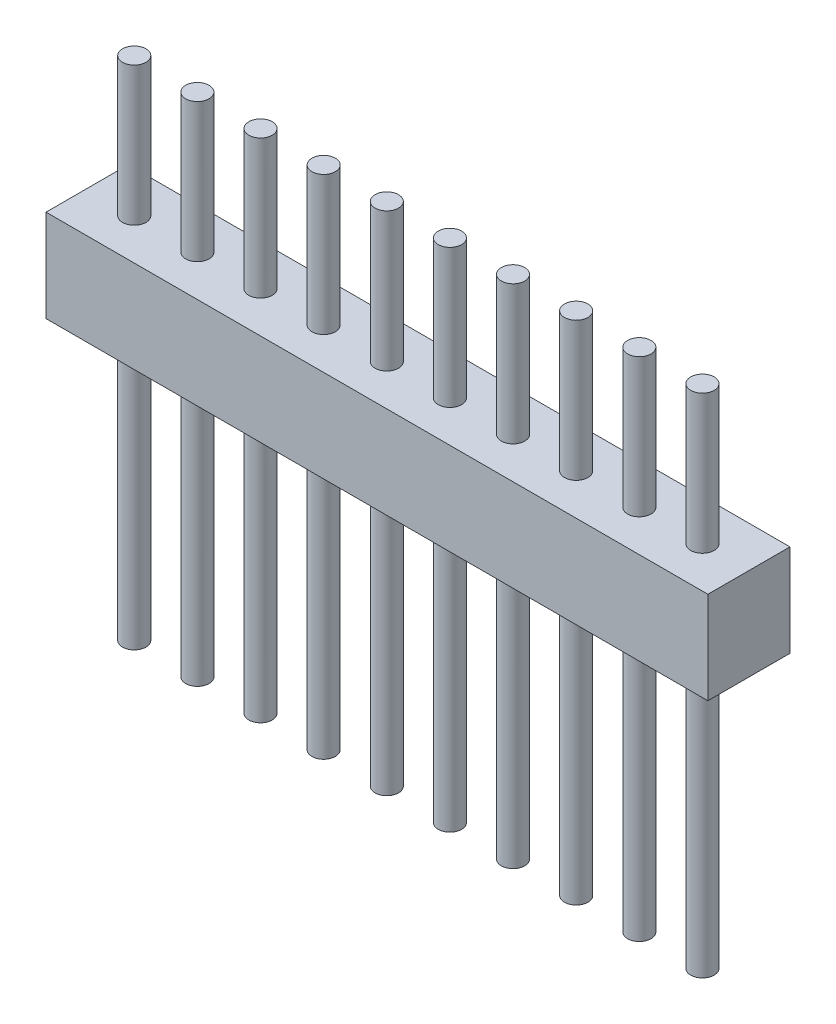
ISO-10303-21;
HEADER;
FILE_DESCRIPTION(('STEP AP214'),'2;1');
FILE_NAME('part.step','',(''),(''),'','','');
FILE_SCHEMA(('AUTOMOTIVE_DESIGN { 1 0 10303 214 1 1 1 1 }'));
ENDSEC;
DATA;
#1=APPLICATION_CONTEXT('core data for automotive mechanical design processes');
#2=APPLICATION_PROTOCOL_DEFINITION('international standard','automotive_design',2000,#1);
#3=PRODUCT_CONTEXT('',#1,'mechanical');
#4=PRODUCT('Part','Part','',(#3));
#5=PRODUCT_RELATED_PRODUCT_CATEGORY('part','',(#4));
#6=PRODUCT_DEFINITION_FORMATION('','',#4);
#7=PRODUCT_DEFINITION_CONTEXT('part definition',#1,'design');
#8=PRODUCT_DEFINITION('design','',#6,#7);
#9=PRODUCT_DEFINITION_SHAPE('','',#8);
#10=(LENGTH_UNIT() NAMED_UNIT(*) SI_UNIT(.MILLI.,.METRE.));
#11=(NAMED_UNIT(*) PLANE_ANGLE_UNIT() SI_UNIT($,.RADIAN.));
#12=(NAMED_UNIT(*) SI_UNIT($,.STERADIAN.) SOLID_ANGLE_UNIT());
#13=UNCERTAINTY_MEASURE_WITH_UNIT(LENGTH_MEASURE(1.E-05),#10,'distance_accuracy_value','');
#14=(GEOMETRIC_REPRESENTATION_CONTEXT(3) GLOBAL_UNCERTAINTY_ASSIGNED_CONTEXT((#13)) GLOBAL_UNIT_ASSIGNED_CONTEXT((#10,
#11,#12)) REPRESENTATION_CONTEXT('',''));
#15=CARTESIAN_POINT('',(0.,0.,0.));
#16=DIRECTION('',(0.,0.,1.));
#17=DIRECTION('',(1.,0.,0.));
#18=AXIS2_PLACEMENT_3D('',#15,#16,#17);
#19=CARTESIAN_POINT('',(0.,2.6,0.));
#20=DIRECTION('',(1.,0.,0.));
#21=DIRECTION('',(0.,0.,-1.));
#22=AXIS2_PLACEMENT_3D('',#19,#20,#21);
#23=PLANE('',#22);
#24=DIRECTION('',(0.,0.,1.));
#25=VECTOR('',#24,1.);
#26=CARTESIAN_POINT('',(0.,0.,0.));
#27=LINE('',#26,#25);
#28=CARTESIAN_POINT('',(0.,0.,-2.314));
#29=VERTEX_POINT('',#28);
#30=CARTESIAN_POINT('',(0.,0.,0.));
#31=VERTEX_POINT('',#30);
#32=EDGE_CURVE('E104',#29,#31,#27,.T.);
#33=ORIENTED_EDGE('',*,*,#32,.T.);
#34=DIRECTION('',(0.,-1.,0.));
#35=VECTOR('',#34,1.);
#36=CARTESIAN_POINT('',(0.,2.6,0.));
#37=LINE('',#36,#35);
#38=CARTESIAN_POINT('',(0.,2.6,0.));
#39=VERTEX_POINT('',#38);
#40=EDGE_CURVE('E95',#39,#31,#37,.T.);
#41=ORIENTED_EDGE('',*,*,#40,.F.);
#42=DIRECTION('',(0.,0.,1.));
#43=VECTOR('',#42,1.);
#44=CARTESIAN_POINT('',(0.,2.6,0.));
#45=LINE('',#44,#43);
#46=CARTESIAN_POINT('',(0.,2.6,-2.314));
#47=VERTEX_POINT('',#46);
#48=EDGE_CURVE('E89',#47,#39,#45,.T.);
#49=ORIENTED_EDGE('',*,*,#48,.F.);
#50=DIRECTION('',(0.,-1.,0.));
#51=VECTOR('',#50,1.);
#52=CARTESIAN_POINT('',(0.,2.6,-2.314));
#53=LINE('',#52,#51);
#54=EDGE_CURVE('E100',#47,#29,#53,.T.);
#55=ORIENTED_EDGE('',*,*,#54,.T.);
#56=EDGE_LOOP('',(#33,#41,#49,#55));
#57=FACE_BOUND('',#56,.T.);
#58=ADVANCED_FACE('F37',(#57),#23,.F.);
#59=CARTESIAN_POINT('',(0.,2.6,0.));
#60=DIRECTION('',(0.,0.,-1.));
#61=DIRECTION('',(-1.,0.,0.));
#62=AXIS2_PLACEMENT_3D('',#59,#60,#61);
#63=PLANE('',#62);
#64=DIRECTION('',(1.,0.,0.));
#65=VECTOR('',#64,1.);
#66=CARTESIAN_POINT('',(0.,0.,0.));
#67=LINE('',#66,#65);
#68=CARTESIAN_POINT('',(18.66,0.,0.));
#69=VERTEX_POINT('',#68);
#70=EDGE_CURVE('E94',#31,#69,#67,.T.);
#71=ORIENTED_EDGE('',*,*,#70,.T.);
#72=DIRECTION('',(0.,-1.,0.));
#73=VECTOR('',#72,1.);
#74=CARTESIAN_POINT('',(18.66,2.6,0.));
#75=LINE('',#74,#73);
#76=CARTESIAN_POINT('',(18.66,2.6,0.));
#77=VERTEX_POINT('',#76);
#78=EDGE_CURVE('E92',#77,#69,#75,.T.);
#79=ORIENTED_EDGE('',*,*,#78,.F.);
#80=DIRECTION('',(1.,0.,0.));
#81=VECTOR('',#80,1.);
#82=CARTESIAN_POINT('',(0.,2.6,0.));
#83=LINE('',#82,#81);
#84=EDGE_CURVE('E84',#39,#77,#83,.T.);
#85=ORIENTED_EDGE('',*,*,#84,.F.);
#86=ORIENTED_EDGE('',*,*,#40,.T.);
#87=EDGE_LOOP('',(#71,#79,#85,#86));
#88=FACE_BOUND('',#87,.T.);
#89=ADVANCED_FACE('F93',(#88),#63,.F.);
#90=CARTESIAN_POINT('',(18.66,2.6,0.));
#91=DIRECTION('',(-1.,0.,0.));
#92=DIRECTION('',(0.,0.,1.));
#93=AXIS2_PLACEMENT_3D('',#90,#91,#92);
#94=PLANE('',#93);
#95=DIRECTION('',(0.,0.,-1.));
#96=VECTOR('',#95,1.);
#97=CARTESIAN_POINT('',(18.66,0.,0.));
#98=LINE('',#97,#96);
#99=CARTESIAN_POINT('',(18.66,0.,-2.314));
#100=VERTEX_POINT('',#99);
#101=EDGE_CURVE('E70',#69,#100,#98,.T.);
#102=ORIENTED_EDGE('',*,*,#101,.T.);
#103=DIRECTION('',(0.,-1.,0.));
#104=VECTOR('',#103,1.);
#105=CARTESIAN_POINT('',(18.66,2.6,-2.314));
#106=LINE('',#105,#104);
#107=CARTESIAN_POINT('',(18.66,2.6,-2.314));
#108=VERTEX_POINT('',#107);
#109=EDGE_CURVE('E96',#108,#100,#106,.T.);
#110=ORIENTED_EDGE('',*,*,#109,.F.);
#111=DIRECTION('',(0.,0.,-1.));
#112=VECTOR('',#111,1.);
#113=CARTESIAN_POINT('',(18.66,2.6,0.));
#114=LINE('',#113,#112);
#115=EDGE_CURVE('E87',#77,#108,#114,.T.);
#116=ORIENTED_EDGE('',*,*,#115,.F.);
#117=ORIENTED_EDGE('',*,*,#78,.T.);
#118=EDGE_LOOP('',(#102,#110,#116,#117));
#119=FACE_BOUND('',#118,.T.);
#120=ADVANCED_FACE('F98',(#119),#94,.F.);
#121=CARTESIAN_POINT('',(0.,2.6,-2.314));
#122=DIRECTION('',(0.,0.,1.));
#123=DIRECTION('',(1.,0.,0.));
#124=AXIS2_PLACEMENT_3D('',#121,#122,#123);
#125=PLANE('',#124);
#126=DIRECTION('',(-1.,0.,0.));
#127=VECTOR('',#126,1.);
#128=CARTESIAN_POINT('',(0.,0.,-2.314));
#129=LINE('',#128,#127);
#130=EDGE_CURVE('E76',#100,#29,#129,.T.);
#131=ORIENTED_EDGE('',*,*,#130,.T.);
#132=ORIENTED_EDGE('',*,*,#54,.F.);
#133=DIRECTION('',(-1.,0.,0.));
#134=VECTOR('',#133,1.);
#135=CARTESIAN_POINT('',(0.,2.6,-2.314));
#136=LINE('',#135,#134);
#137=EDGE_CURVE('E53',#108,#47,#136,.T.);
#138=ORIENTED_EDGE('',*,*,#137,.F.);
#139=ORIENTED_EDGE('',*,*,#109,.T.);
#140=EDGE_LOOP('',(#131,#132,#138,#139));
#141=FACE_BOUND('',#140,.T.);
#142=ADVANCED_FACE('F167',(#141),#125,.F.);
#143=CARTESIAN_POINT('',(0.,2.6,0.));
#144=DIRECTION('',(0.,-1.,0.));
#145=DIRECTION('',(0.,0.,-1.));
#146=AXIS2_PLACEMENT_3D('',#143,#144,#145);
#147=PLANE('',#146);
#148=CARTESIAN_POINT('',(17.35,2.6,-1.157));
#149=DIRECTION('',(0.,-1.,0.));
#150=DIRECTION('',(0.,0.,-1.));
#151=AXIS2_PLACEMENT_3D('',#148,#149,#150);
#152=CIRCLE('',#151,0.33);
#153=CARTESIAN_POINT('',(17.35,2.6,-1.487));
#154=VERTEX_POINT('',#153);
#155=EDGE_CURVE('E600',#154,#154,#152,.T.);
#156=ORIENTED_EDGE('',*,*,#155,.T.);
#157=EDGE_LOOP('',(#156));
#158=FACE_BOUND('',#157,.T.);
#159=CARTESIAN_POINT('',(15.57,2.6,-1.157));
#160=DIRECTION('',(0.,-1.,0.));
#161=DIRECTION('',(0.,0.,-1.));
#162=AXIS2_PLACEMENT_3D('',#159,#160,#161);
#163=CIRCLE('',#162,0.33);
#164=CARTESIAN_POINT('',(15.57,2.6,-1.487));
#165=VERTEX_POINT('',#164);
#166=EDGE_CURVE('E611',#165,#165,#163,.T.);
#167=ORIENTED_EDGE('',*,*,#166,.T.);
#168=EDGE_LOOP('',(#167));
#169=FACE_BOUND('',#168,.T.);
#170=CARTESIAN_POINT('',(13.79,2.6,-1.157));
#171=DIRECTION('',(0.,-1.,0.));
#172=DIRECTION('',(0.,0.,-1.));
#173=AXIS2_PLACEMENT_3D('',#170,#171,#172);
#174=CIRCLE('',#173,0.33);
#175=CARTESIAN_POINT('',(13.79,2.6,-1.487));
#176=VERTEX_POINT('',#175);
#177=EDGE_CURVE('E620',#176,#176,#174,.T.);
#178=ORIENTED_EDGE('',*,*,#177,.T.);
#179=EDGE_LOOP('',(#178));
#180=FACE_BOUND('',#179,.T.);
#181=CARTESIAN_POINT('',(12.01,2.6,-1.157));
#182=DIRECTION('',(0.,-1.,0.));
#183=DIRECTION('',(0.,0.,-1.));
#184=AXIS2_PLACEMENT_3D('',#181,#182,#183);
#185=CIRCLE('',#184,0.33);
#186=CARTESIAN_POINT('',(12.01,2.6,-1.487));
#187=VERTEX_POINT('',#186);
#188=EDGE_CURVE('E629',#187,#187,#185,.T.);
#189=ORIENTED_EDGE('',*,*,#188,.T.);
#190=EDGE_LOOP('',(#189));
#191=FACE_BOUND('',#190,.T.);
#192=CARTESIAN_POINT('',(10.23,2.6,-1.157));
#193=DIRECTION('',(0.,-1.,0.));
#194=DIRECTION('',(0.,0.,-1.));
#195=AXIS2_PLACEMENT_3D('',#192,#193,#194);
#196=CIRCLE('',#195,0.33);
#197=CARTESIAN_POINT('',(10.23,2.6,-1.487));
#198=VERTEX_POINT('',#197);
#199=EDGE_CURVE('E638',#198,#198,#196,.T.);
#200=ORIENTED_EDGE('',*,*,#199,.T.);
#201=EDGE_LOOP('',(#200));
#202=FACE_BOUND('',#201,.T.);
#203=CARTESIAN_POINT('',(8.45,2.6,-1.157));
#204=DIRECTION('',(0.,-1.,0.));
#205=DIRECTION('',(0.,0.,-1.));
#206=AXIS2_PLACEMENT_3D('',#203,#204,#205);
#207=CIRCLE('',#206,0.33);
#208=CARTESIAN_POINT('',(8.45,2.6,-1.487));
#209=VERTEX_POINT('',#208);
#210=EDGE_CURVE('E647',#209,#209,#207,.T.);
#211=ORIENTED_EDGE('',*,*,#210,.T.);
#212=EDGE_LOOP('',(#211));
#213=FACE_BOUND('',#212,.T.);
#214=CARTESIAN_POINT('',(6.67,2.6,-1.157));
#215=DIRECTION('',(0.,-1.,0.));
#216=DIRECTION('',(0.,0.,-1.));
#217=AXIS2_PLACEMENT_3D('',#214,#215,#216);
#218=CIRCLE('',#217,0.33);
#219=CARTESIAN_POINT('',(6.67,2.6,-1.487));
#220=VERTEX_POINT('',#219);
#221=EDGE_CURVE('E656',#220,#220,#218,.T.);
#222=ORIENTED_EDGE('',*,*,#221,.T.);
#223=EDGE_LOOP('',(#222));
#224=FACE_BOUND('',#223,.T.);
#225=CARTESIAN_POINT('',(4.89,2.6,-1.157));
#226=DIRECTION('',(0.,-1.,0.));
#227=DIRECTION('',(0.,0.,-1.));
#228=AXIS2_PLACEMENT_3D('',#225,#226,#227);
#229=CIRCLE('',#228,0.33);
#230=CARTESIAN_POINT('',(4.89,2.6,-1.487));
#231=VERTEX_POINT('',#230);
#232=EDGE_CURVE('E665',#231,#231,#229,.T.);
#233=ORIENTED_EDGE('',*,*,#232,.T.);
#234=EDGE_LOOP('',(#233));
#235=FACE_BOUND('',#234,.T.);
#236=CARTESIAN_POINT('',(3.11,2.6,-1.157));
#237=DIRECTION('',(0.,-1.,0.));
#238=DIRECTION('',(0.,0.,-1.));
#239=AXIS2_PLACEMENT_3D('',#236,#237,#238);
#240=CIRCLE('',#239,0.33);
#241=CARTESIAN_POINT('',(3.11,2.6,-1.487));
#242=VERTEX_POINT('',#241);
#243=EDGE_CURVE('E674',#242,#242,#240,.T.);
#244=ORIENTED_EDGE('',*,*,#243,.T.);
#245=EDGE_LOOP('',(#244));
#246=FACE_BOUND('',#245,.T.);
#247=CARTESIAN_POINT('',(1.33,2.6,-1.157));
#248=DIRECTION('',(0.,-1.,0.));
#249=DIRECTION('',(0.,0.,-1.));
#250=AXIS2_PLACEMENT_3D('',#247,#248,#249);
#251=CIRCLE('',#250,0.33);
#252=CARTESIAN_POINT('',(1.33,2.6,-1.487));
#253=VERTEX_POINT('',#252);
#254=EDGE_CURVE('E107',#253,#253,#251,.T.);
#255=ORIENTED_EDGE('',*,*,#254,.T.);
#256=EDGE_LOOP('',(#255));
#257=FACE_BOUND('',#256,.T.);
#258=ORIENTED_EDGE('',*,*,#48,.T.);
#259=ORIENTED_EDGE('',*,*,#84,.T.);
#260=ORIENTED_EDGE('',*,*,#115,.T.);
#261=ORIENTED_EDGE('',*,*,#137,.T.);
#262=EDGE_LOOP('',(#258,#259,#260,#261));
#263=FACE_BOUND('',#262,.T.);
#264=ADVANCED_FACE('F85',(#158,#169,#180,#191,#202,#213,#224,#235,#246,#257,#263),#147,.F.);
#265=CARTESIAN_POINT('',(0.,0.,0.));
#266=DIRECTION('',(0.,-1.,0.));
#267=DIRECTION('',(0.,0.,-1.));
#268=AXIS2_PLACEMENT_3D('',#265,#266,#267);
#269=PLANE('',#268);
#270=CARTESIAN_POINT('',(17.35,0.,-1.157));
#271=DIRECTION('',(0.,-1.,0.));
#272=DIRECTION('',(0.,0.,-1.));
#273=AXIS2_PLACEMENT_3D('',#270,#271,#272);
#274=CIRCLE('',#273,0.33);
#275=CARTESIAN_POINT('',(17.35,0.,-1.487));
#276=VERTEX_POINT('',#275);
#277=EDGE_CURVE('E11',#276,#276,#274,.T.);
#278=ORIENTED_EDGE('',*,*,#277,.F.);
#279=EDGE_LOOP('',(#278));
#280=FACE_BOUND('',#279,.T.);
#281=CARTESIAN_POINT('',(15.57,0.,-1.157));
#282=DIRECTION('',(0.,-1.,0.));
#283=DIRECTION('',(0.,0.,-1.));
#284=AXIS2_PLACEMENT_3D('',#281,#282,#283);
#285=CIRCLE('',#284,0.33);
#286=CARTESIAN_POINT('',(15.57,0.,-1.487));
#287=VERTEX_POINT('',#286);
#288=EDGE_CURVE('E45',#287,#287,#285,.T.);
#289=ORIENTED_EDGE('',*,*,#288,.F.);
#290=EDGE_LOOP('',(#289));
#291=FACE_BOUND('',#290,.T.);
#292=CARTESIAN_POINT('',(13.79,0.,-1.157));
#293=DIRECTION('',(0.,-1.,0.));
#294=DIRECTION('',(0.,0.,-1.));
#295=AXIS2_PLACEMENT_3D('',#292,#293,#294);
#296=CIRCLE('',#295,0.33);
#297=CARTESIAN_POINT('',(13.79,0.,-1.487));
#298=VERTEX_POINT('',#297);
#299=EDGE_CURVE('E135',#298,#298,#296,.T.);
#300=ORIENTED_EDGE('',*,*,#299,.F.);
#301=EDGE_LOOP('',(#300));
#302=FACE_BOUND('',#301,.T.);
#303=CARTESIAN_POINT('',(12.01,0.,-1.157));
#304=DIRECTION('',(0.,-1.,0.));
#305=DIRECTION('',(0.,0.,-1.));
#306=AXIS2_PLACEMENT_3D('',#303,#304,#305);
#307=CIRCLE('',#306,0.33);
#308=CARTESIAN_POINT('',(12.01,0.,-1.487));
#309=VERTEX_POINT('',#308);
#310=EDGE_CURVE('E132',#309,#309,#307,.T.);
#311=ORIENTED_EDGE('',*,*,#310,.F.);
#312=EDGE_LOOP('',(#311));
#313=FACE_BOUND('',#312,.T.);
#314=CARTESIAN_POINT('',(10.23,0.,-1.157));
#315=DIRECTION('',(0.,-1.,0.));
#316=DIRECTION('',(0.,0.,-1.));
#317=AXIS2_PLACEMENT_3D('',#314,#315,#316);
#318=CIRCLE('',#317,0.33);
#319=CARTESIAN_POINT('',(10.23,0.,-1.487));
#320=VERTEX_POINT('',#319);
#321=EDGE_CURVE('E129',#320,#320,#318,.T.);
#322=ORIENTED_EDGE('',*,*,#321,.F.);
#323=EDGE_LOOP('',(#322));
#324=FACE_BOUND('',#323,.T.);
#325=CARTESIAN_POINT('',(8.45,0.,-1.157));
#326=DIRECTION('',(0.,-1.,0.));
#327=DIRECTION('',(0.,0.,-1.));
#328=AXIS2_PLACEMENT_3D('',#325,#326,#327);
#329=CIRCLE('',#328,0.33);
#330=CARTESIAN_POINT('',(8.45,0.,-1.487));
#331=VERTEX_POINT('',#330);
#332=EDGE_CURVE('E126',#331,#331,#329,.T.);
#333=ORIENTED_EDGE('',*,*,#332,.F.);
#334=EDGE_LOOP('',(#333));
#335=FACE_BOUND('',#334,.T.);
#336=CARTESIAN_POINT('',(6.67,0.,-1.157));
#337=DIRECTION('',(0.,-1.,0.));
#338=DIRECTION('',(0.,0.,-1.));
#339=AXIS2_PLACEMENT_3D('',#336,#337,#338);
#340=CIRCLE('',#339,0.33);
#341=CARTESIAN_POINT('',(6.67,0.,-1.487));
#342=VERTEX_POINT('',#341);
#343=EDGE_CURVE('E123',#342,#342,#340,.T.);
#344=ORIENTED_EDGE('',*,*,#343,.F.);
#345=EDGE_LOOP('',(#344));
#346=FACE_BOUND('',#345,.T.);
#347=CARTESIAN_POINT('',(4.89,0.,-1.157));
#348=DIRECTION('',(0.,-1.,0.));
#349=DIRECTION('',(0.,0.,-1.));
#350=AXIS2_PLACEMENT_3D('',#347,#348,#349);
#351=CIRCLE('',#350,0.33);
#352=CARTESIAN_POINT('',(4.89,0.,-1.487));
#353=VERTEX_POINT('',#352);
#354=EDGE_CURVE('E120',#353,#353,#351,.T.);
#355=ORIENTED_EDGE('',*,*,#354,.F.);
#356=EDGE_LOOP('',(#355));
#357=FACE_BOUND('',#356,.T.);
#358=CARTESIAN_POINT('',(3.11,0.,-1.157));
#359=DIRECTION('',(0.,-1.,0.));
#360=DIRECTION('',(0.,0.,-1.));
#361=AXIS2_PLACEMENT_3D('',#358,#359,#360);
#362=CIRCLE('',#361,0.33);
#363=CARTESIAN_POINT('',(3.11,0.,-1.487));
#364=VERTEX_POINT('',#363);
#365=EDGE_CURVE('E117',#364,#364,#362,.T.);
#366=ORIENTED_EDGE('',*,*,#365,.F.);
#367=EDGE_LOOP('',(#366));
#368=FACE_BOUND('',#367,.T.);
#369=CARTESIAN_POINT('',(1.33,0.,-1.157));
#370=DIRECTION('',(0.,-1.,0.));
#371=DIRECTION('',(0.,0.,-1.));
#372=AXIS2_PLACEMENT_3D('',#369,#370,#371);
#373=CIRCLE('',#372,0.33);
#374=CARTESIAN_POINT('',(1.33,0.,-1.487));
#375=VERTEX_POINT('',#374);
#376=EDGE_CURVE('E114',#375,#375,#373,.T.);
#377=ORIENTED_EDGE('',*,*,#376,.F.);
#378=EDGE_LOOP('',(#377));
#379=FACE_BOUND('',#378,.T.);
#380=ORIENTED_EDGE('',*,*,#32,.F.);
#381=ORIENTED_EDGE('',*,*,#130,.F.);
#382=ORIENTED_EDGE('',*,*,#101,.F.);
#383=ORIENTED_EDGE('',*,*,#70,.F.);
#384=EDGE_LOOP('',(#380,#381,#382,#383));
#385=FACE_BOUND('',#384,.T.);
#386=ADVANCED_FACE('F143',(#280,#291,#302,#313,#324,#335,#346,#357,#368,#379,#385),#269,.T.);
#387=CARTESIAN_POINT('',(1.33,-7.77,-1.157));
#388=DIRECTION('',(0.,1.,0.));
#389=DIRECTION('',(0.,0.,1.));
#390=AXIS2_PLACEMENT_3D('',#387,#388,#389);
#391=PLANE('',#390);
#392=CARTESIAN_POINT('',(1.33,-7.77,-1.157));
#393=DIRECTION('',(0.,1.,0.));
#394=DIRECTION('',(0.,0.,1.));
#395=AXIS2_PLACEMENT_3D('',#392,#393,#394);
#396=CIRCLE('',#395,0.33);
#397=CARTESIAN_POINT('',(1.33,-7.77,-0.827));
#398=VERTEX_POINT('',#397);
#399=EDGE_CURVE('E680',#398,#398,#396,.T.);
#400=ORIENTED_EDGE('',*,*,#399,.F.);
#401=EDGE_LOOP('',(#400));
#402=FACE_BOUND('',#401,.T.);
#403=ADVANCED_FACE('F146',(#402),#391,.F.);
#404=CARTESIAN_POINT('',(1.33,-7.77,-1.157));
#405=DIRECTION('',(0.,1.,0.));
#406=DIRECTION('',(0.,0.,1.));
#407=AXIS2_PLACEMENT_3D('',#404,#405,#406);
#408=CYLINDRICAL_SURFACE('',#407,0.33);
#409=ORIENTED_EDGE('',*,*,#376,.T.);
#410=EDGE_LOOP('',(#409));
#411=FACE_BOUND('',#410,.T.);
#412=ORIENTED_EDGE('',*,*,#399,.T.);
#413=EDGE_LOOP('',(#412));
#414=FACE_BOUND('',#413,.T.);
#415=ADVANCED_FACE('F212',(#411,#414),#408,.T.);
#416=CARTESIAN_POINT('',(1.33,6.51,-1.157));
#417=DIRECTION('',(0.,1.,0.));
#418=DIRECTION('',(0.,0.,1.));
#419=AXIS2_PLACEMENT_3D('',#416,#417,#418);
#420=CIRCLE('',#419,0.33);
#421=CARTESIAN_POINT('',(1.33,6.51,-0.827));
#422=VERTEX_POINT('',#421);
#423=EDGE_CURVE('E677',#422,#422,#420,.T.);
#424=ORIENTED_EDGE('',*,*,#423,.F.);
#425=EDGE_LOOP('',(#424));
#426=FACE_BOUND('',#425,.T.);
#427=ORIENTED_EDGE('',*,*,#254,.F.);
#428=EDGE_LOOP('',(#427));
#429=FACE_BOUND('',#428,.T.);
#430=ADVANCED_FACE('F222',(#426,#429),#408,.T.);
#431=CARTESIAN_POINT('',(1.33,6.51,-1.157));
#432=DIRECTION('',(0.,1.,0.));
#433=DIRECTION('',(0.,0.,1.));
#434=AXIS2_PLACEMENT_3D('',#431,#432,#433);
#435=PLANE('',#434);
#436=ORIENTED_EDGE('',*,*,#423,.T.);
#437=EDGE_LOOP('',(#436));
#438=FACE_BOUND('',#437,.T.);
#439=ADVANCED_FACE('F232',(#438),#435,.T.);
#440=CARTESIAN_POINT('',(3.11,-7.77,-1.157));
#441=DIRECTION('',(0.,1.,0.));
#442=DIRECTION('',(0.,0.,1.));
#443=AXIS2_PLACEMENT_3D('',#440,#441,#442);
#444=PLANE('',#443);
#445=CARTESIAN_POINT('',(3.11,-7.77,-1.157));
#446=DIRECTION('',(0.,1.,0.));
#447=DIRECTION('',(0.,0.,1.));
#448=AXIS2_PLACEMENT_3D('',#445,#446,#447);
#449=CIRCLE('',#448,0.33);
#450=CARTESIAN_POINT('',(3.11,-7.77,-0.827));
#451=VERTEX_POINT('',#450);
#452=EDGE_CURVE('E671',#451,#451,#449,.T.);
#453=ORIENTED_EDGE('',*,*,#452,.F.);
#454=EDGE_LOOP('',(#453));
#455=FACE_BOUND('',#454,.T.);
#456=ADVANCED_FACE('F241',(#455),#444,.F.);
#457=CARTESIAN_POINT('',(3.11,-7.77,-1.157));
#458=DIRECTION('',(0.,1.,0.));
#459=DIRECTION('',(0.,0.,1.));
#460=AXIS2_PLACEMENT_3D('',#457,#458,#459);
#461=CYLINDRICAL_SURFACE('',#460,0.33);
#462=ORIENTED_EDGE('',*,*,#365,.T.);
#463=EDGE_LOOP('',(#462));
#464=FACE_BOUND('',#463,.T.);
#465=ORIENTED_EDGE('',*,*,#452,.T.);
#466=EDGE_LOOP('',(#465));
#467=FACE_BOUND('',#466,.T.);
#468=ADVANCED_FACE('F251',(#464,#467),#461,.T.);
#469=CARTESIAN_POINT('',(3.11,6.51,-1.157));
#470=DIRECTION('',(0.,1.,0.));
#471=DIRECTION('',(0.,0.,1.));
#472=AXIS2_PLACEMENT_3D('',#469,#470,#471);
#473=CIRCLE('',#472,0.33);
#474=CARTESIAN_POINT('',(3.11,6.51,-0.827));
#475=VERTEX_POINT('',#474);
#476=EDGE_CURVE('E668',#475,#475,#473,.T.);
#477=ORIENTED_EDGE('',*,*,#476,.F.);
#478=EDGE_LOOP('',(#477));
#479=FACE_BOUND('',#478,.T.);
#480=ORIENTED_EDGE('',*,*,#243,.F.);
#481=EDGE_LOOP('',(#480));
#482=FACE_BOUND('',#481,.T.);
#483=ADVANCED_FACE('F261',(#479,#482),#461,.T.);
#484=CARTESIAN_POINT('',(3.11,6.51,-1.157));
#485=DIRECTION('',(0.,1.,0.));
#486=DIRECTION('',(0.,0.,1.));
#487=AXIS2_PLACEMENT_3D('',#484,#485,#486);
#488=PLANE('',#487);
#489=ORIENTED_EDGE('',*,*,#476,.T.);
#490=EDGE_LOOP('',(#489));
#491=FACE_BOUND('',#490,.T.);
#492=ADVANCED_FACE('F271',(#491),#488,.T.);
#493=CARTESIAN_POINT('',(4.89,-7.77,-1.157));
#494=DIRECTION('',(0.,1.,0.));
#495=DIRECTION('',(0.,0.,1.));
#496=AXIS2_PLACEMENT_3D('',#493,#494,#495);
#497=PLANE('',#496);
#498=CARTESIAN_POINT('',(4.89,-7.77,-1.157));
#499=DIRECTION('',(0.,1.,0.));
#500=DIRECTION('',(0.,0.,1.));
#501=AXIS2_PLACEMENT_3D('',#498,#499,#500);
#502=CIRCLE('',#501,0.33);
#503=CARTESIAN_POINT('',(4.89,-7.77,-0.827));
#504=VERTEX_POINT('',#503);
#505=EDGE_CURVE('E662',#504,#504,#502,.T.);
#506=ORIENTED_EDGE('',*,*,#505,.F.);
#507=EDGE_LOOP('',(#506));
#508=FACE_BOUND('',#507,.T.);
#509=ADVANCED_FACE('F280',(#508),#497,.F.);
#510=CARTESIAN_POINT('',(4.89,-7.77,-1.157));
#511=DIRECTION('',(0.,1.,0.));
#512=DIRECTION('',(0.,0.,1.));
#513=AXIS2_PLACEMENT_3D('',#510,#511,#512);
#514=CYLINDRICAL_SURFACE('',#513,0.33);
#515=ORIENTED_EDGE('',*,*,#354,.T.);
#516=EDGE_LOOP('',(#515));
#517=FACE_BOUND('',#516,.T.);
#518=ORIENTED_EDGE('',*,*,#505,.T.);
#519=EDGE_LOOP('',(#518));
#520=FACE_BOUND('',#519,.T.);
#521=ADVANCED_FACE('F290',(#517,#520),#514,.T.);
#522=CARTESIAN_POINT('',(4.89,6.51,-1.157));
#523=DIRECTION('',(0.,1.,0.));
#524=DIRECTION('',(0.,0.,1.));
#525=AXIS2_PLACEMENT_3D('',#522,#523,#524);
#526=CIRCLE('',#525,0.33);
#527=CARTESIAN_POINT('',(4.89,6.51,-0.827));
#528=VERTEX_POINT('',#527);
#529=EDGE_CURVE('E659',#528,#528,#526,.T.);
#530=ORIENTED_EDGE('',*,*,#529,.F.);
#531=EDGE_LOOP('',(#530));
#532=FACE_BOUND('',#531,.T.);
#533=ORIENTED_EDGE('',*,*,#232,.F.);
#534=EDGE_LOOP('',(#533));
#535=FACE_BOUND('',#534,.T.);
#536=ADVANCED_FACE('F300',(#532,#535),#514,.T.);
#537=CARTESIAN_POINT('',(4.89,6.51,-1.157));
#538=DIRECTION('',(0.,1.,0.));
#539=DIRECTION('',(0.,0.,1.));
#540=AXIS2_PLACEMENT_3D('',#537,#538,#539);
#541=PLANE('',#540);
#542=ORIENTED_EDGE('',*,*,#529,.T.);
#543=EDGE_LOOP('',(#542));
#544=FACE_BOUND('',#543,.T.);
#545=ADVANCED_FACE('F310',(#544),#541,.T.);
#546=CARTESIAN_POINT('',(6.67,-7.77,-1.157));
#547=DIRECTION('',(0.,1.,0.));
#548=DIRECTION('',(0.,0.,1.));
#549=AXIS2_PLACEMENT_3D('',#546,#547,#548);
#550=PLANE('',#549);
#551=CARTESIAN_POINT('',(6.67,-7.77,-1.157));
#552=DIRECTION('',(0.,1.,0.));
#553=DIRECTION('',(0.,0.,1.));
#554=AXIS2_PLACEMENT_3D('',#551,#552,#553);
#555=CIRCLE('',#554,0.33);
#556=CARTESIAN_POINT('',(6.67,-7.77,-0.827000000000001));
#557=VERTEX_POINT('',#556);
#558=EDGE_CURVE('E653',#557,#557,#555,.T.);
#559=ORIENTED_EDGE('',*,*,#558,.F.);
#560=EDGE_LOOP('',(#559));
#561=FACE_BOUND('',#560,.T.);
#562=ADVANCED_FACE('F319',(#561),#550,.F.);
#563=CARTESIAN_POINT('',(6.67,-7.77,-1.157));
#564=DIRECTION('',(0.,1.,0.));
#565=DIRECTION('',(0.,0.,1.));
#566=AXIS2_PLACEMENT_3D('',#563,#564,#565);
#567=CYLINDRICAL_SURFACE('',#566,0.33);
#568=ORIENTED_EDGE('',*,*,#343,.T.);
#569=EDGE_LOOP('',(#568));
#570=FACE_BOUND('',#569,.T.);
#571=ORIENTED_EDGE('',*,*,#558,.T.);
#572=EDGE_LOOP('',(#571));
#573=FACE_BOUND('',#572,.T.);
#574=ADVANCED_FACE('F329',(#570,#573),#567,.T.);
#575=CARTESIAN_POINT('',(6.67,6.51,-1.157));
#576=DIRECTION('',(0.,1.,0.));
#577=DIRECTION('',(0.,0.,1.));
#578=AXIS2_PLACEMENT_3D('',#575,#576,#577);
#579=CIRCLE('',#578,0.33);
#580=CARTESIAN_POINT('',(6.67,6.51,-0.827000000000001));
#581=VERTEX_POINT('',#580);
#582=EDGE_CURVE('E650',#581,#581,#579,.T.);
#583=ORIENTED_EDGE('',*,*,#582,.F.);
#584=EDGE_LOOP('',(#583));
#585=FACE_BOUND('',#584,.T.);
#586=ORIENTED_EDGE('',*,*,#221,.F.);
#587=EDGE_LOOP('',(#586));
#588=FACE_BOUND('',#587,.T.);
#589=ADVANCED_FACE('F339',(#585,#588),#567,.T.);
#590=CARTESIAN_POINT('',(6.67,6.51,-1.157));
#591=DIRECTION('',(0.,1.,0.));
#592=DIRECTION('',(0.,0.,1.));
#593=AXIS2_PLACEMENT_3D('',#590,#591,#592);
#594=PLANE('',#593);
#595=ORIENTED_EDGE('',*,*,#582,.T.);
#596=EDGE_LOOP('',(#595));
#597=FACE_BOUND('',#596,.T.);
#598=ADVANCED_FACE('F349',(#597),#594,.T.);
#599=CARTESIAN_POINT('',(8.45,-7.77,-1.157));
#600=DIRECTION('',(0.,1.,0.));
#601=DIRECTION('',(0.,0.,1.));
#602=AXIS2_PLACEMENT_3D('',#599,#600,#601);
#603=PLANE('',#602);
#604=CARTESIAN_POINT('',(8.45,-7.77,-1.157));
#605=DIRECTION('',(0.,1.,0.));
#606=DIRECTION('',(0.,0.,1.));
#607=AXIS2_PLACEMENT_3D('',#604,#605,#606);
#608=CIRCLE('',#607,0.33);
#609=CARTESIAN_POINT('',(8.45,-7.77,-0.827));
#610=VERTEX_POINT('',#609);
#611=EDGE_CURVE('E644',#610,#610,#608,.T.);
#612=ORIENTED_EDGE('',*,*,#611,.F.);
#613=EDGE_LOOP('',(#612));
#614=FACE_BOUND('',#613,.T.);
#615=ADVANCED_FACE('F358',(#614),#603,.F.);
#616=CARTESIAN_POINT('',(8.45,-7.77,-1.157));
#617=DIRECTION('',(0.,1.,0.));
#618=DIRECTION('',(0.,0.,1.));
#619=AXIS2_PLACEMENT_3D('',#616,#617,#618);
#620=CYLINDRICAL_SURFACE('',#619,0.33);
#621=ORIENTED_EDGE('',*,*,#332,.T.);
#622=EDGE_LOOP('',(#621));
#623=FACE_BOUND('',#622,.T.);
#624=ORIENTED_EDGE('',*,*,#611,.T.);
#625=EDGE_LOOP('',(#624));
#626=FACE_BOUND('',#625,.T.);
#627=ADVANCED_FACE('F368',(#623,#626),#620,.T.);
#628=CARTESIAN_POINT('',(8.45,6.51,-1.157));
#629=DIRECTION('',(0.,1.,0.));
#630=DIRECTION('',(0.,0.,1.));
#631=AXIS2_PLACEMENT_3D('',#628,#629,#630);
#632=CIRCLE('',#631,0.33);
#633=CARTESIAN_POINT('',(8.45,6.51,-0.827));
#634=VERTEX_POINT('',#633);
#635=EDGE_CURVE('E641',#634,#634,#632,.T.);
#636=ORIENTED_EDGE('',*,*,#635,.F.);
#637=EDGE_LOOP('',(#636));
#638=FACE_BOUND('',#637,.T.);
#639=ORIENTED_EDGE('',*,*,#210,.F.);
#640=EDGE_LOOP('',(#639));
#641=FACE_BOUND('',#640,.T.);
#642=ADVANCED_FACE('F378',(#638,#641),#620,.T.);
#643=CARTESIAN_POINT('',(8.45,6.51,-1.157));
#644=DIRECTION('',(0.,1.,0.));
#645=DIRECTION('',(0.,0.,1.));
#646=AXIS2_PLACEMENT_3D('',#643,#644,#645);
#647=PLANE('',#646);
#648=ORIENTED_EDGE('',*,*,#635,.T.);
#649=EDGE_LOOP('',(#648));
#650=FACE_BOUND('',#649,.T.);
#651=ADVANCED_FACE('F388',(#650),#647,.T.);
#652=CARTESIAN_POINT('',(10.23,-7.77,-1.157));
#653=DIRECTION('',(0.,1.,0.));
#654=DIRECTION('',(0.,0.,1.));
#655=AXIS2_PLACEMENT_3D('',#652,#653,#654);
#656=PLANE('',#655);
#657=CARTESIAN_POINT('',(10.23,-7.77,-1.157));
#658=DIRECTION('',(0.,1.,0.));
#659=DIRECTION('',(0.,0.,1.));
#660=AXIS2_PLACEMENT_3D('',#657,#658,#659);
#661=CIRCLE('',#660,0.33);
#662=CARTESIAN_POINT('',(10.23,-7.77,-0.827));
#663=VERTEX_POINT('',#662);
#664=EDGE_CURVE('E635',#663,#663,#661,.T.);
#665=ORIENTED_EDGE('',*,*,#664,.F.);
#666=EDGE_LOOP('',(#665));
#667=FACE_BOUND('',#666,.T.);
#668=ADVANCED_FACE('F397',(#667),#656,.F.);
#669=CARTESIAN_POINT('',(10.23,-7.77,-1.157));
#670=DIRECTION('',(0.,1.,0.));
#671=DIRECTION('',(0.,0.,1.));
#672=AXIS2_PLACEMENT_3D('',#669,#670,#671);
#673=CYLINDRICAL_SURFACE('',#672,0.33);
#674=ORIENTED_EDGE('',*,*,#321,.T.);
#675=EDGE_LOOP('',(#674));
#676=FACE_BOUND('',#675,.T.);
#677=ORIENTED_EDGE('',*,*,#664,.T.);
#678=EDGE_LOOP('',(#677));
#679=FACE_BOUND('',#678,.T.);
#680=ADVANCED_FACE('F407',(#676,#679),#673,.T.);
#681=CARTESIAN_POINT('',(10.23,6.51,-1.157));
#682=DIRECTION('',(0.,1.,0.));
#683=DIRECTION('',(0.,0.,1.));
#684=AXIS2_PLACEMENT_3D('',#681,#682,#683);
#685=CIRCLE('',#684,0.33);
#686=CARTESIAN_POINT('',(10.23,6.51,-0.827));
#687=VERTEX_POINT('',#686);
#688=EDGE_CURVE('E632',#687,#687,#685,.T.);
#689=ORIENTED_EDGE('',*,*,#688,.F.);
#690=EDGE_LOOP('',(#689));
#691=FACE_BOUND('',#690,.T.);
#692=ORIENTED_EDGE('',*,*,#199,.F.);
#693=EDGE_LOOP('',(#692));
#694=FACE_BOUND('',#693,.T.);
#695=ADVANCED_FACE('F417',(#691,#694),#673,.T.);
#696=CARTESIAN_POINT('',(10.23,6.51,-1.157));
#697=DIRECTION('',(0.,1.,0.));
#698=DIRECTION('',(0.,0.,1.));
#699=AXIS2_PLACEMENT_3D('',#696,#697,#698);
#700=PLANE('',#699);
#701=ORIENTED_EDGE('',*,*,#688,.T.);
#702=EDGE_LOOP('',(#701));
#703=FACE_BOUND('',#702,.T.);
#704=ADVANCED_FACE('F427',(#703),#700,.T.);
#705=CARTESIAN_POINT('',(12.01,-7.77,-1.157));
#706=DIRECTION('',(0.,1.,0.));
#707=DIRECTION('',(0.,0.,1.));
#708=AXIS2_PLACEMENT_3D('',#705,#706,#707);
#709=PLANE('',#708);
#710=CARTESIAN_POINT('',(12.01,-7.77,-1.157));
#711=DIRECTION('',(0.,1.,0.));
#712=DIRECTION('',(0.,0.,1.));
#713=AXIS2_PLACEMENT_3D('',#710,#711,#712);
#714=CIRCLE('',#713,0.33);
#715=CARTESIAN_POINT('',(12.01,-7.77,-0.827));
#716=VERTEX_POINT('',#715);
#717=EDGE_CURVE('E626',#716,#716,#714,.T.);
#718=ORIENTED_EDGE('',*,*,#717,.F.);
#719=EDGE_LOOP('',(#718));
#720=FACE_BOUND('',#719,.T.);
#721=ADVANCED_FACE('F436',(#720),#709,.F.);
#722=CARTESIAN_POINT('',(12.01,-7.77,-1.157));
#723=DIRECTION('',(0.,1.,0.));
#724=DIRECTION('',(0.,0.,1.));
#725=AXIS2_PLACEMENT_3D('',#722,#723,#724);
#726=CYLINDRICAL_SURFACE('',#725,0.33);
#727=ORIENTED_EDGE('',*,*,#310,.T.);
#728=EDGE_LOOP('',(#727));
#729=FACE_BOUND('',#728,.T.);
#730=ORIENTED_EDGE('',*,*,#717,.T.);
#731=EDGE_LOOP('',(#730));
#732=FACE_BOUND('',#731,.T.);
#733=ADVANCED_FACE('F446',(#729,#732),#726,.T.);
#734=CARTESIAN_POINT('',(12.01,6.51,-1.157));
#735=DIRECTION('',(0.,1.,0.));
#736=DIRECTION('',(0.,0.,1.));
#737=AXIS2_PLACEMENT_3D('',#734,#735,#736);
#738=CIRCLE('',#737,0.33);
#739=CARTESIAN_POINT('',(12.01,6.51,-0.827));
#740=VERTEX_POINT('',#739);
#741=EDGE_CURVE('E623',#740,#740,#738,.T.);
#742=ORIENTED_EDGE('',*,*,#741,.F.);
#743=EDGE_LOOP('',(#742));
#744=FACE_BOUND('',#743,.T.);
#745=ORIENTED_EDGE('',*,*,#188,.F.);
#746=EDGE_LOOP('',(#745));
#747=FACE_BOUND('',#746,.T.);
#748=ADVANCED_FACE('F456',(#744,#747),#726,.T.);
#749=CARTESIAN_POINT('',(12.01,6.51,-1.157));
#750=DIRECTION('',(0.,1.,0.));
#751=DIRECTION('',(0.,0.,1.));
#752=AXIS2_PLACEMENT_3D('',#749,#750,#751);
#753=PLANE('',#752);
#754=ORIENTED_EDGE('',*,*,#741,.T.);
#755=EDGE_LOOP('',(#754));
#756=FACE_BOUND('',#755,.T.);
#757=ADVANCED_FACE('F466',(#756),#753,.T.);
#758=CARTESIAN_POINT('',(13.79,-7.77,-1.157));
#759=DIRECTION('',(0.,1.,0.));
#760=DIRECTION('',(0.,0.,1.));
#761=AXIS2_PLACEMENT_3D('',#758,#759,#760);
#762=PLANE('',#761);
#763=CARTESIAN_POINT('',(13.79,-7.77,-1.157));
#764=DIRECTION('',(0.,1.,0.));
#765=DIRECTION('',(0.,0.,1.));
#766=AXIS2_PLACEMENT_3D('',#763,#764,#765);
#767=CIRCLE('',#766,0.33);
#768=CARTESIAN_POINT('',(13.79,-7.77,-0.827));
#769=VERTEX_POINT('',#768);
#770=EDGE_CURVE('E617',#769,#769,#767,.T.);
#771=ORIENTED_EDGE('',*,*,#770,.F.);
#772=EDGE_LOOP('',(#771));
#773=FACE_BOUND('',#772,.T.);
#774=ADVANCED_FACE('F475',(#773),#762,.F.);
#775=CARTESIAN_POINT('',(13.79,-7.77,-1.157));
#776=DIRECTION('',(0.,1.,0.));
#777=DIRECTION('',(0.,0.,1.));
#778=AXIS2_PLACEMENT_3D('',#775,#776,#777);
#779=CYLINDRICAL_SURFACE('',#778,0.33);
#780=ORIENTED_EDGE('',*,*,#299,.T.);
#781=EDGE_LOOP('',(#780));
#782=FACE_BOUND('',#781,.T.);
#783=ORIENTED_EDGE('',*,*,#770,.T.);
#784=EDGE_LOOP('',(#783));
#785=FACE_BOUND('',#784,.T.);
#786=ADVANCED_FACE('F485',(#782,#785),#779,.T.);
#787=CARTESIAN_POINT('',(13.79,6.51,-1.157));
#788=DIRECTION('',(0.,1.,0.));
#789=DIRECTION('',(0.,0.,1.));
#790=AXIS2_PLACEMENT_3D('',#787,#788,#789);
#791=CIRCLE('',#790,0.33);
#792=CARTESIAN_POINT('',(13.79,6.51,-0.827));
#793=VERTEX_POINT('',#792);
#794=EDGE_CURVE('E614',#793,#793,#791,.T.);
#795=ORIENTED_EDGE('',*,*,#794,.F.);
#796=EDGE_LOOP('',(#795));
#797=FACE_BOUND('',#796,.T.);
#798=ORIENTED_EDGE('',*,*,#177,.F.);
#799=EDGE_LOOP('',(#798));
#800=FACE_BOUND('',#799,.T.);
#801=ADVANCED_FACE('F495',(#797,#800),#779,.T.);
#802=CARTESIAN_POINT('',(13.79,6.51,-1.157));
#803=DIRECTION('',(0.,1.,0.));
#804=DIRECTION('',(0.,0.,1.));
#805=AXIS2_PLACEMENT_3D('',#802,#803,#804);
#806=PLANE('',#805);
#807=ORIENTED_EDGE('',*,*,#794,.T.);
#808=EDGE_LOOP('',(#807));
#809=FACE_BOUND('',#808,.T.);
#810=ADVANCED_FACE('F505',(#809),#806,.T.);
#811=CARTESIAN_POINT('',(15.57,-7.77,-1.157));
#812=DIRECTION('',(0.,1.,0.));
#813=DIRECTION('',(0.,0.,1.));
#814=AXIS2_PLACEMENT_3D('',#811,#812,#813);
#815=PLANE('',#814);
#816=CARTESIAN_POINT('',(15.57,-7.77,-1.157));
#817=DIRECTION('',(0.,1.,0.));
#818=DIRECTION('',(0.,0.,1.));
#819=AXIS2_PLACEMENT_3D('',#816,#817,#818);
#820=CIRCLE('',#819,0.33);
#821=CARTESIAN_POINT('',(15.57,-7.77,-0.827));
#822=VERTEX_POINT('',#821);
#823=EDGE_CURVE('E608',#822,#822,#820,.T.);
#824=ORIENTED_EDGE('',*,*,#823,.F.);
#825=EDGE_LOOP('',(#824));
#826=FACE_BOUND('',#825,.T.);
#827=ADVANCED_FACE('F514',(#826),#815,.F.);
#828=CARTESIAN_POINT('',(15.57,-7.77,-1.157));
#829=DIRECTION('',(0.,1.,0.));
#830=DIRECTION('',(0.,0.,1.));
#831=AXIS2_PLACEMENT_3D('',#828,#829,#830);
#832=CYLINDRICAL_SURFACE('',#831,0.33);
#833=ORIENTED_EDGE('',*,*,#288,.T.);
#834=EDGE_LOOP('',(#833));
#835=FACE_BOUND('',#834,.T.);
#836=ORIENTED_EDGE('',*,*,#823,.T.);
#837=EDGE_LOOP('',(#836));
#838=FACE_BOUND('',#837,.T.);
#839=ADVANCED_FACE('F140',(#835,#838),#832,.T.);
#840=CARTESIAN_POINT('',(15.57,6.51,-1.157));
#841=DIRECTION('',(0.,1.,0.));
#842=DIRECTION('',(0.,0.,1.));
#843=AXIS2_PLACEMENT_3D('',#840,#841,#842);
#844=CIRCLE('',#843,0.33);
#845=CARTESIAN_POINT('',(15.57,6.51,-0.827));
#846=VERTEX_POINT('',#845);
#847=EDGE_CURVE('E605',#846,#846,#844,.T.);
#848=ORIENTED_EDGE('',*,*,#847,.F.);
#849=EDGE_LOOP('',(#848));
#850=FACE_BOUND('',#849,.T.);
#851=ORIENTED_EDGE('',*,*,#166,.F.);
#852=EDGE_LOOP('',(#851));
#853=FACE_BOUND('',#852,.T.);
#854=ADVANCED_FACE('F533',(#850,#853),#832,.T.);
#855=CARTESIAN_POINT('',(15.57,6.51,-1.157));
#856=DIRECTION('',(0.,1.,0.));
#857=DIRECTION('',(0.,0.,1.));
#858=AXIS2_PLACEMENT_3D('',#855,#856,#857);
#859=PLANE('',#858);
#860=ORIENTED_EDGE('',*,*,#847,.T.);
#861=EDGE_LOOP('',(#860));
#862=FACE_BOUND('',#861,.T.);
#863=ADVANCED_FACE('F542',(#862),#859,.T.);
#864=CARTESIAN_POINT('',(17.35,-7.77,-1.157));
#865=DIRECTION('',(0.,1.,0.));
#866=DIRECTION('',(0.,0.,1.));
#867=AXIS2_PLACEMENT_3D('',#864,#865,#866);
#868=PLANE('',#867);
#869=CARTESIAN_POINT('',(17.35,-7.77,-1.157));
#870=DIRECTION('',(0.,1.,0.));
#871=DIRECTION('',(0.,0.,1.));
#872=AXIS2_PLACEMENT_3D('',#869,#870,#871);
#873=CIRCLE('',#872,0.33);
#874=CARTESIAN_POINT('',(17.35,-7.77,-0.827));
#875=VERTEX_POINT('',#874);
#876=EDGE_CURVE('E597',#875,#875,#873,.T.);
#877=ORIENTED_EDGE('',*,*,#876,.F.);
#878=EDGE_LOOP('',(#877));
#879=FACE_BOUND('',#878,.T.);
#880=ADVANCED_FACE('F551',(#879),#868,.F.);
#881=CARTESIAN_POINT('',(17.35,-7.77,-1.157));
#882=DIRECTION('',(0.,1.,0.));
#883=DIRECTION('',(0.,0.,1.));
#884=AXIS2_PLACEMENT_3D('',#881,#882,#883);
#885=CYLINDRICAL_SURFACE('',#884,0.33);
#886=ORIENTED_EDGE('',*,*,#277,.T.);
#887=EDGE_LOOP('',(#886));
#888=FACE_BOUND('',#887,.T.);
#889=ORIENTED_EDGE('',*,*,#876,.T.);
#890=EDGE_LOOP('',(#889));
#891=FACE_BOUND('',#890,.T.);
#892=ADVANCED_FACE('F561',(#888,#891),#885,.T.);
#893=CARTESIAN_POINT('',(17.35,6.51,-1.157));
#894=DIRECTION('',(0.,1.,0.));
#895=DIRECTION('',(0.,0.,1.));
#896=AXIS2_PLACEMENT_3D('',#893,#894,#895);
#897=CIRCLE('',#896,0.33);
#898=CARTESIAN_POINT('',(17.35,6.51,-0.827));
#899=VERTEX_POINT('',#898);
#900=EDGE_CURVE('E596',#899,#899,#897,.T.);
#901=ORIENTED_EDGE('',*,*,#900,.F.);
#902=EDGE_LOOP('',(#901));
#903=FACE_BOUND('',#902,.T.);
#904=ORIENTED_EDGE('',*,*,#155,.F.);
#905=EDGE_LOOP('',(#904));
#906=FACE_BOUND('',#905,.T.);
#907=ADVANCED_FACE('F571',(#903,#906),#885,.T.);
#908=CARTESIAN_POINT('',(17.35,6.51,-1.157));
#909=DIRECTION('',(0.,1.,0.));
#910=DIRECTION('',(0.,0.,1.));
#911=AXIS2_PLACEMENT_3D('',#908,#909,#910);
#912=PLANE('',#911);
#913=ORIENTED_EDGE('',*,*,#900,.T.);
#914=EDGE_LOOP('',(#913));
#915=FACE_BOUND('',#914,.T.);
#916=ADVANCED_FACE('F581',(#915),#912,.T.);
#917=CLOSED_SHELL('',(#58,#89,#120,#142,#264,#386,#403,#415,#430,#439,#456,#468,#483,#492,#509,
#521,#536,#545,#562,#574,#589,#598,#615,#627,#642,#651,#668,#680,#695,#704,#721,#733,#748,#757,
#774,#786,#801,#810,#827,#839,#854,#863,#880,#892,#907,#916));
#918=MANIFOLD_SOLID_BREP('B2',#917);
#919=ADVANCED_BREP_SHAPE_REPRESENTATION('',(#18,#918),#14);
#920=SHAPE_DEFINITION_REPRESENTATION(#9,#919);
ENDSEC;
END-ISO-10303-21;
